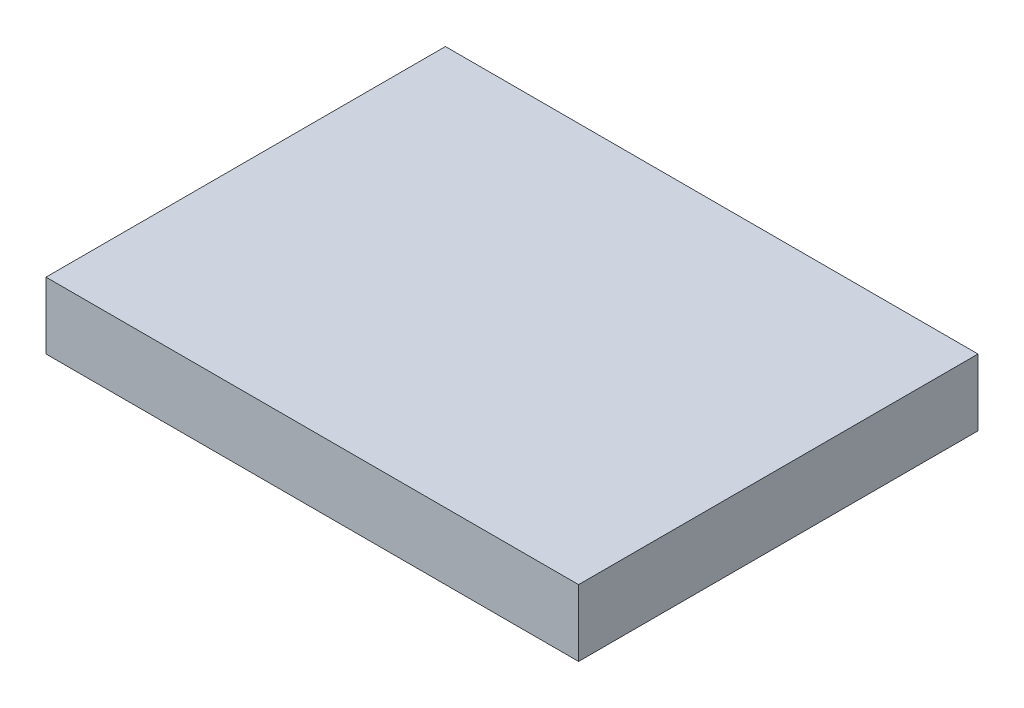
ISO-10303-21;
HEADER;
FILE_DESCRIPTION(('STEP AP214'),'2;1');
FILE_NAME('part.step','',(''),(''),'','','');
FILE_SCHEMA(('AUTOMOTIVE_DESIGN { 1 0 10303 214 1 1 1 1 }'));
ENDSEC;
DATA;
#1=APPLICATION_CONTEXT('core data for automotive mechanical design processes');
#2=APPLICATION_PROTOCOL_DEFINITION('international standard','automotive_design',2000,#1);
#3=PRODUCT_CONTEXT('',#1,'mechanical');
#4=PRODUCT('Part','Part','',(#3));
#5=PRODUCT_RELATED_PRODUCT_CATEGORY('part','',(#4));
#6=PRODUCT_DEFINITION_FORMATION('','',#4);
#7=PRODUCT_DEFINITION_CONTEXT('part definition',#1,'design');
#8=PRODUCT_DEFINITION('design','',#6,#7);
#9=PRODUCT_DEFINITION_SHAPE('','',#8);
#10=(LENGTH_UNIT() NAMED_UNIT(*) SI_UNIT(.MILLI.,.METRE.));
#11=(NAMED_UNIT(*) PLANE_ANGLE_UNIT() SI_UNIT($,.RADIAN.));
#12=(NAMED_UNIT(*) SI_UNIT($,.STERADIAN.) SOLID_ANGLE_UNIT());
#13=UNCERTAINTY_MEASURE_WITH_UNIT(LENGTH_MEASURE(1.E-05),#10,'distance_accuracy_value','');
#14=(GEOMETRIC_REPRESENTATION_CONTEXT(3) GLOBAL_UNCERTAINTY_ASSIGNED_CONTEXT((#13)) GLOBAL_UNIT_ASSIGNED_CONTEXT((#10,
#11,#12)) REPRESENTATION_CONTEXT('',''));
#15=CARTESIAN_POINT('',(0.,0.,0.));
#16=DIRECTION('',(0.,0.,1.));
#17=DIRECTION('',(1.,0.,0.));
#18=AXIS2_PLACEMENT_3D('',#15,#16,#17);
#19=CARTESIAN_POINT('',(-35.2816308895176,3.,-12.2002599653379));
#20=DIRECTION('',(-1.,0.,0.));
#21=DIRECTION('',(0.,0.,1.));
#22=AXIS2_PLACEMENT_3D('',#19,#20,#21);
#23=PLANE('',#22);
#24=DIRECTION('',(0.,0.,-1.));
#25=VECTOR('',#24,1.);
#26=CARTESIAN_POINT('',(-35.2816308895176,0.,-12.2002599653379));
#27=LINE('',#26,#25);
#28=CARTESIAN_POINT('',(-35.2816308895176,0.,5.79974003466205));
#29=VERTEX_POINT('',#28);
#30=CARTESIAN_POINT('',(-35.2816308895176,0.,-12.2002599653379));
#31=VERTEX_POINT('',#30);
#32=EDGE_CURVE('E99',#29,#31,#27,.T.);
#33=ORIENTED_EDGE('',*,*,#32,.T.);
#34=DIRECTION('',(0.,-1.,0.));
#35=VECTOR('',#34,1.);
#36=CARTESIAN_POINT('',(-35.2816308895176,3.,-12.2002599653379));
#37=LINE('',#36,#35);
#38=CARTESIAN_POINT('',(-35.2816308895176,3.,-12.2002599653379));
#39=VERTEX_POINT('',#38);
#40=EDGE_CURVE('E11',#39,#31,#37,.T.);
#41=ORIENTED_EDGE('',*,*,#40,.F.);
#42=DIRECTION('',(0.,0.,-1.));
#43=VECTOR('',#42,1.);
#44=CARTESIAN_POINT('',(-35.2816308895176,3.,-12.2002599653379));
#45=LINE('',#44,#43);
#46=CARTESIAN_POINT('',(-35.2816308895176,3.,5.79974003466205));
#47=VERTEX_POINT('',#46);
#48=EDGE_CURVE('E87',#47,#39,#45,.T.);
#49=ORIENTED_EDGE('',*,*,#48,.F.);
#50=DIRECTION('',(0.,-1.,0.));
#51=VECTOR('',#50,1.);
#52=CARTESIAN_POINT('',(-35.2816308895176,3.,5.79974003466205));
#53=LINE('',#52,#51);
#54=EDGE_CURVE('E95',#47,#29,#53,.T.);
#55=ORIENTED_EDGE('',*,*,#54,.T.);
#56=EDGE_LOOP('',(#33,#41,#49,#55));
#57=FACE_BOUND('',#56,.T.);
#58=ADVANCED_FACE('F36',(#57),#23,.F.);
#59=CARTESIAN_POINT('',(-59.2816308895176,3.,-12.2002599653379));
#60=DIRECTION('',(0.,0.,1.));
#61=DIRECTION('',(1.,0.,0.));
#62=AXIS2_PLACEMENT_3D('',#59,#60,#61);
#63=PLANE('',#62);
#64=DIRECTION('',(-1.,0.,0.));
#65=VECTOR('',#64,1.);
#66=CARTESIAN_POINT('',(-59.2816308895176,0.,-12.2002599653379));
#67=LINE('',#66,#65);
#68=CARTESIAN_POINT('',(-59.2816308895176,0.,-12.2002599653379));
#69=VERTEX_POINT('',#68);
#70=EDGE_CURVE('E91',#31,#69,#67,.T.);
#71=ORIENTED_EDGE('',*,*,#70,.T.);
#72=DIRECTION('',(0.,-1.,0.));
#73=VECTOR('',#72,1.);
#74=CARTESIAN_POINT('',(-59.2816308895176,3.,-12.2002599653379));
#75=LINE('',#74,#73);
#76=CARTESIAN_POINT('',(-59.2816308895176,3.,-12.2002599653379));
#77=VERTEX_POINT('',#76);
#78=EDGE_CURVE('E44',#77,#69,#75,.T.);
#79=ORIENTED_EDGE('',*,*,#78,.F.);
#80=DIRECTION('',(-1.,0.,0.));
#81=VECTOR('',#80,1.);
#82=CARTESIAN_POINT('',(-59.2816308895176,3.,-12.2002599653379));
#83=LINE('',#82,#81);
#84=EDGE_CURVE('E82',#39,#77,#83,.T.);
#85=ORIENTED_EDGE('',*,*,#84,.F.);
#86=ORIENTED_EDGE('',*,*,#40,.T.);
#87=EDGE_LOOP('',(#71,#79,#85,#86));
#88=FACE_BOUND('',#87,.T.);
#89=ADVANCED_FACE('F90',(#88),#63,.F.);
#90=CARTESIAN_POINT('',(-59.2816308895176,3.,-12.2002599653379));
#91=DIRECTION('',(1.,0.,0.));
#92=DIRECTION('',(0.,0.,-1.));
#93=AXIS2_PLACEMENT_3D('',#90,#91,#92);
#94=PLANE('',#93);
#95=DIRECTION('',(0.,0.,1.));
#96=VECTOR('',#95,1.);
#97=CARTESIAN_POINT('',(-59.2816308895176,0.,-12.2002599653379));
#98=LINE('',#97,#96);
#99=CARTESIAN_POINT('',(-59.2816308895176,0.,5.79974003466205));
#100=VERTEX_POINT('',#99);
#101=EDGE_CURVE('E69',#69,#100,#98,.T.);
#102=ORIENTED_EDGE('',*,*,#101,.T.);
#103=DIRECTION('',(0.,-1.,0.));
#104=VECTOR('',#103,1.);
#105=CARTESIAN_POINT('',(-59.2816308895176,3.,5.79974003466205));
#106=LINE('',#105,#104);
#107=CARTESIAN_POINT('',(-59.2816308895176,3.,5.79974003466205));
#108=VERTEX_POINT('',#107);
#109=EDGE_CURVE('E92',#108,#100,#106,.T.);
#110=ORIENTED_EDGE('',*,*,#109,.F.);
#111=DIRECTION('',(0.,0.,1.));
#112=VECTOR('',#111,1.);
#113=CARTESIAN_POINT('',(-59.2816308895176,3.,-12.2002599653379));
#114=LINE('',#113,#112);
#115=EDGE_CURVE('E85',#77,#108,#114,.T.);
#116=ORIENTED_EDGE('',*,*,#115,.F.);
#117=ORIENTED_EDGE('',*,*,#78,.T.);
#118=EDGE_LOOP('',(#102,#110,#116,#117));
#119=FACE_BOUND('',#118,.T.);
#120=ADVANCED_FACE('F93',(#119),#94,.F.);
#121=CARTESIAN_POINT('',(-59.2816308895176,3.,5.79974003466205));
#122=DIRECTION('',(0.,0.,-1.));
#123=DIRECTION('',(-1.,0.,0.));
#124=AXIS2_PLACEMENT_3D('',#121,#122,#123);
#125=PLANE('',#124);
#126=DIRECTION('',(1.,0.,0.));
#127=VECTOR('',#126,1.);
#128=CARTESIAN_POINT('',(-59.2816308895176,0.,5.79974003466205));
#129=LINE('',#128,#127);
#130=EDGE_CURVE('E75',#100,#29,#129,.T.);
#131=ORIENTED_EDGE('',*,*,#130,.T.);
#132=ORIENTED_EDGE('',*,*,#54,.F.);
#133=DIRECTION('',(1.,0.,0.));
#134=VECTOR('',#133,1.);
#135=CARTESIAN_POINT('',(-59.2816308895176,3.,5.79974003466205));
#136=LINE('',#135,#134);
#137=EDGE_CURVE('E52',#108,#47,#136,.T.);
#138=ORIENTED_EDGE('',*,*,#137,.F.);
#139=ORIENTED_EDGE('',*,*,#109,.T.);
#140=EDGE_LOOP('',(#131,#132,#138,#139));
#141=FACE_BOUND('',#140,.T.);
#142=ADVANCED_FACE('F106',(#141),#125,.F.);
#143=CARTESIAN_POINT('',(0.,3.,0.));
#144=DIRECTION('',(0.,1.,0.));
#145=DIRECTION('',(0.,0.,1.));
#146=AXIS2_PLACEMENT_3D('',#143,#144,#145);
#147=PLANE('',#146);
#148=ORIENTED_EDGE('',*,*,#48,.T.);
#149=ORIENTED_EDGE('',*,*,#84,.T.);
#150=ORIENTED_EDGE('',*,*,#115,.T.);
#151=ORIENTED_EDGE('',*,*,#137,.T.);
#152=EDGE_LOOP('',(#148,#149,#150,#151));
#153=FACE_BOUND('',#152,.T.);
#154=ADVANCED_FACE('F83',(#153),#147,.T.);
#155=CARTESIAN_POINT('',(0.,0.,0.));
#156=DIRECTION('',(0.,1.,0.));
#157=DIRECTION('',(0.,0.,1.));
#158=AXIS2_PLACEMENT_3D('',#155,#156,#157);
#159=PLANE('',#158);
#160=ORIENTED_EDGE('',*,*,#32,.F.);
#161=ORIENTED_EDGE('',*,*,#130,.F.);
#162=ORIENTED_EDGE('',*,*,#101,.F.);
#163=ORIENTED_EDGE('',*,*,#70,.F.);
#164=EDGE_LOOP('',(#160,#161,#162,#163));
#165=FACE_BOUND('',#164,.T.);
#166=ADVANCED_FACE('F109',(#165),#159,.F.);
#167=CLOSED_SHELL('',(#58,#89,#120,#142,#154,#166));
#168=MANIFOLD_SOLID_BREP('B2',#167);
#169=ADVANCED_BREP_SHAPE_REPRESENTATION('',(#18,#168),#14);
#170=SHAPE_DEFINITION_REPRESENTATION(#9,#169);
ENDSEC;
END-ISO-10303-21;
